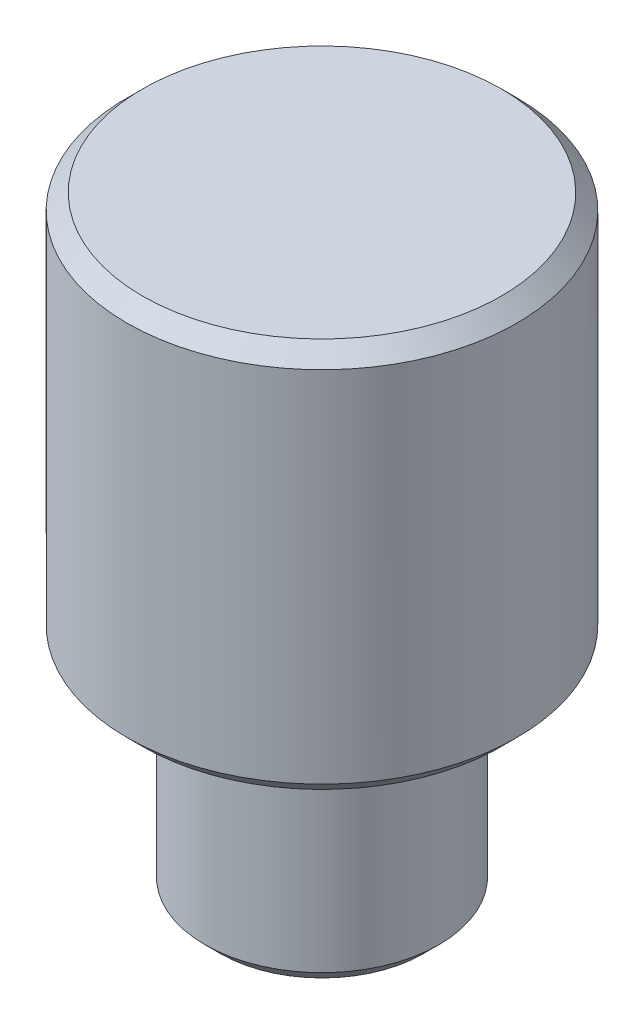
ISO-10303-21;
HEADER;
FILE_DESCRIPTION(('STEP AP214'),'2;1');
FILE_NAME('part.step','',(''),(''),'','','');
FILE_SCHEMA(('AUTOMOTIVE_DESIGN { 1 0 10303 214 1 1 1 1 }'));
ENDSEC;
DATA;
#1=APPLICATION_CONTEXT('core data for automotive mechanical design processes');
#2=APPLICATION_PROTOCOL_DEFINITION('international standard','automotive_design',2000,#1);
#3=PRODUCT_CONTEXT('',#1,'mechanical');
#4=PRODUCT('Part','Part','',(#3));
#5=PRODUCT_RELATED_PRODUCT_CATEGORY('part','',(#4));
#6=PRODUCT_DEFINITION_FORMATION('','',#4);
#7=PRODUCT_DEFINITION_CONTEXT('part definition',#1,'design');
#8=PRODUCT_DEFINITION('design','',#6,#7);
#9=PRODUCT_DEFINITION_SHAPE('','',#8);
#10=(LENGTH_UNIT() NAMED_UNIT(*) SI_UNIT(.MILLI.,.METRE.));
#11=(NAMED_UNIT(*) PLANE_ANGLE_UNIT() SI_UNIT($,.RADIAN.));
#12=(NAMED_UNIT(*) SI_UNIT($,.STERADIAN.) SOLID_ANGLE_UNIT());
#13=UNCERTAINTY_MEASURE_WITH_UNIT(LENGTH_MEASURE(1.E-05),#10,'distance_accuracy_value','');
#14=(GEOMETRIC_REPRESENTATION_CONTEXT(3) GLOBAL_UNCERTAINTY_ASSIGNED_CONTEXT((#13)) GLOBAL_UNIT_ASSIGNED_CONTEXT((#10,
#11,#12)) REPRESENTATION_CONTEXT('',''));
#15=CARTESIAN_POINT('',(0.,0.,0.));
#16=DIRECTION('',(0.,0.,1.));
#17=DIRECTION('',(1.,0.,0.));
#18=AXIS2_PLACEMENT_3D('',#15,#16,#17);
#19=CARTESIAN_POINT('',(0.,0.,0.));
#20=DIRECTION('',(0.,-1.,0.));
#21=DIRECTION('',(0.,0.,-1.));
#22=AXIS2_PLACEMENT_3D('',#19,#20,#21);
#23=PLANE('',#22);
#24=CARTESIAN_POINT('',(0.,0.,0.));
#25=DIRECTION('',(0.,-1.,0.));
#26=DIRECTION('',(0.,0.,-1.));
#27=AXIS2_PLACEMENT_3D('',#24,#25,#26);
#28=CIRCLE('',#27,23.);
#29=CARTESIAN_POINT('',(0.,0.,-23.));
#30=VERTEX_POINT('',#29);
#31=EDGE_CURVE('E10',#30,#30,#28,.F.);
#32=ORIENTED_EDGE('',*,*,#31,.T.);
#33=EDGE_LOOP('',(#32));
#34=FACE_BOUND('',#33,.T.);
#35=ADVANCED_FACE('F52',(#34),#23,.F.);
#36=CARTESIAN_POINT('',(0.,0.,0.));
#37=DIRECTION('',(0.,1.,0.));
#38=DIRECTION('',(0.,0.,1.));
#39=AXIS2_PLACEMENT_3D('',#36,#37,#38);
#40=CYLINDRICAL_SURFACE('',#39,25.);
#41=CARTESIAN_POINT('',(0.,-48.,0.));
#42=DIRECTION('',(0.,1.,0.));
#43=DIRECTION('',(0.,0.,1.));
#44=AXIS2_PLACEMENT_3D('',#41,#42,#43);
#45=CIRCLE('',#44,25.);
#46=CARTESIAN_POINT('',(0.,-48.,25.));
#47=VERTEX_POINT('',#46);
#48=EDGE_CURVE('E67',#47,#47,#45,.T.);
#49=ORIENTED_EDGE('',*,*,#48,.T.);
#50=EDGE_LOOP('',(#49));
#51=FACE_BOUND('',#50,.T.);
#52=CARTESIAN_POINT('',(0.,-2.00000000000002,0.));
#53=DIRECTION('',(0.,-1.,0.));
#54=DIRECTION('',(0.,0.,-1.));
#55=AXIS2_PLACEMENT_3D('',#52,#53,#54);
#56=CIRCLE('',#55,25.);
#57=CARTESIAN_POINT('',(0.,-2.00000000000002,-25.));
#58=VERTEX_POINT('',#57);
#59=EDGE_CURVE('E73',#58,#58,#56,.T.);
#60=ORIENTED_EDGE('',*,*,#59,.T.);
#61=EDGE_LOOP('',(#60));
#62=FACE_BOUND('',#61,.T.);
#63=ADVANCED_FACE('F107',(#51,#62),#40,.T.);
#64=CARTESIAN_POINT('',(25.,-50.,0.));
#65=DIRECTION('',(0.,1.,0.));
#66=DIRECTION('',(0.,0.,1.));
#67=AXIS2_PLACEMENT_3D('',#64,#65,#66);
#68=PLANE('',#67);
#69=CARTESIAN_POINT('',(0.,-50.,0.));
#70=DIRECTION('',(0.,1.,0.));
#71=DIRECTION('',(0.,0.,1.));
#72=AXIS2_PLACEMENT_3D('',#69,#70,#71);
#73=CIRCLE('',#72,23.);
#74=CARTESIAN_POINT('',(0.,-50.,23.));
#75=VERTEX_POINT('',#74);
#76=EDGE_CURVE('E61',#75,#75,#73,.F.);
#77=ORIENTED_EDGE('',*,*,#76,.T.);
#78=EDGE_LOOP('',(#77));
#79=FACE_BOUND('',#78,.T.);
#80=CARTESIAN_POINT('',(0.,-50.,0.));
#81=DIRECTION('',(0.,1.,0.));
#82=DIRECTION('',(0.,0.,1.));
#83=AXIS2_PLACEMENT_3D('',#80,#81,#82);
#84=CIRCLE('',#83,15.);
#85=CARTESIAN_POINT('',(0.,-50.,15.));
#86=VERTEX_POINT('',#85);
#87=EDGE_CURVE('E87',#86,#86,#84,.T.);
#88=ORIENTED_EDGE('',*,*,#87,.T.);
#89=EDGE_LOOP('',(#88));
#90=FACE_BOUND('',#89,.T.);
#91=ADVANCED_FACE('F93',(#79,#90),#68,.F.);
#92=CARTESIAN_POINT('',(0.,0.,0.));
#93=DIRECTION('',(0.,1.,0.));
#94=DIRECTION('',(0.,0.,1.));
#95=AXIS2_PLACEMENT_3D('',#92,#93,#94);
#96=CYLINDRICAL_SURFACE('',#95,15.);
#97=CARTESIAN_POINT('',(0.,-76.,0.));
#98=DIRECTION('',(0.,1.,0.));
#99=DIRECTION('',(0.,0.,1.));
#100=AXIS2_PLACEMENT_3D('',#97,#98,#99);
#101=CIRCLE('',#100,15.);
#102=CARTESIAN_POINT('',(0.,-76.,15.));
#103=VERTEX_POINT('',#102);
#104=EDGE_CURVE('E83',#103,#103,#101,.T.);
#105=ORIENTED_EDGE('',*,*,#104,.T.);
#106=EDGE_LOOP('',(#105));
#107=FACE_BOUND('',#106,.T.);
#108=ORIENTED_EDGE('',*,*,#87,.F.);
#109=EDGE_LOOP('',(#108));
#110=FACE_BOUND('',#109,.T.);
#111=ADVANCED_FACE('F95',(#107,#110),#96,.T.);
#112=CARTESIAN_POINT('',(15.,-78.,0.));
#113=DIRECTION('',(0.,1.,0.));
#114=DIRECTION('',(0.,0.,1.));
#115=AXIS2_PLACEMENT_3D('',#112,#113,#114);
#116=PLANE('',#115);
#117=CARTESIAN_POINT('',(0.,-78.,0.));
#118=DIRECTION('',(0.,1.,0.));
#119=DIRECTION('',(0.,0.,1.));
#120=AXIS2_PLACEMENT_3D('',#117,#118,#119);
#121=CIRCLE('',#120,13.);
#122=CARTESIAN_POINT('',(0.,-78.,13.));
#123=VERTEX_POINT('',#122);
#124=EDGE_CURVE('E79',#123,#123,#121,.F.);
#125=ORIENTED_EDGE('',*,*,#124,.T.);
#126=EDGE_LOOP('',(#125));
#127=FACE_BOUND('',#126,.T.);
#128=ADVANCED_FACE('F97',(#127),#116,.F.);
#129=CARTESIAN_POINT('',(0.,-76.,0.));
#130=DIRECTION('',(0.,1.,0.));
#131=DIRECTION('',(0.,0.,1.));
#132=AXIS2_PLACEMENT_3D('',#129,#130,#131);
#133=CONICAL_SURFACE('',#132,15.,0.785398163397452);
#134=ORIENTED_EDGE('',*,*,#124,.F.);
#135=EDGE_LOOP('',(#134));
#136=FACE_BOUND('',#135,.T.);
#137=ORIENTED_EDGE('',*,*,#104,.F.);
#138=EDGE_LOOP('',(#137));
#139=FACE_BOUND('',#138,.T.);
#140=ADVANCED_FACE('F103',(#136,#139),#133,.T.);
#141=CARTESIAN_POINT('',(0.,-48.,0.));
#142=DIRECTION('',(0.,1.,0.));
#143=DIRECTION('',(0.,0.,1.));
#144=AXIS2_PLACEMENT_3D('',#141,#142,#143);
#145=CONICAL_SURFACE('',#144,25.,0.785398163397451);
#146=ORIENTED_EDGE('',*,*,#76,.F.);
#147=EDGE_LOOP('',(#146));
#148=FACE_BOUND('',#147,.T.);
#149=ORIENTED_EDGE('',*,*,#48,.F.);
#150=EDGE_LOOP('',(#149));
#151=FACE_BOUND('',#150,.T.);
#152=ADVANCED_FACE('F123',(#148,#151),#145,.T.);
#153=CARTESIAN_POINT('',(0.,0.,0.));
#154=DIRECTION('',(0.,-1.,0.));
#155=DIRECTION('',(0.,0.,-1.));
#156=AXIS2_PLACEMENT_3D('',#153,#154,#155);
#157=CONICAL_SURFACE('',#156,23.,0.785398163397447);
#158=ORIENTED_EDGE('',*,*,#59,.F.);
#159=EDGE_LOOP('',(#158));
#160=FACE_BOUND('',#159,.T.);
#161=ORIENTED_EDGE('',*,*,#31,.F.);
#162=EDGE_LOOP('',(#161));
#163=FACE_BOUND('',#162,.T.);
#164=ADVANCED_FACE('F55',(#160,#163),#157,.T.);
#165=CLOSED_SHELL('',(#35,#63,#91,#111,#128,#140,#152,#164));
#166=MANIFOLD_SOLID_BREP('B2',#165);
#167=ADVANCED_BREP_SHAPE_REPRESENTATION('',(#18,#166),#14);
#168=SHAPE_DEFINITION_REPRESENTATION(#9,#167);
ENDSEC;
END-ISO-10303-21;
